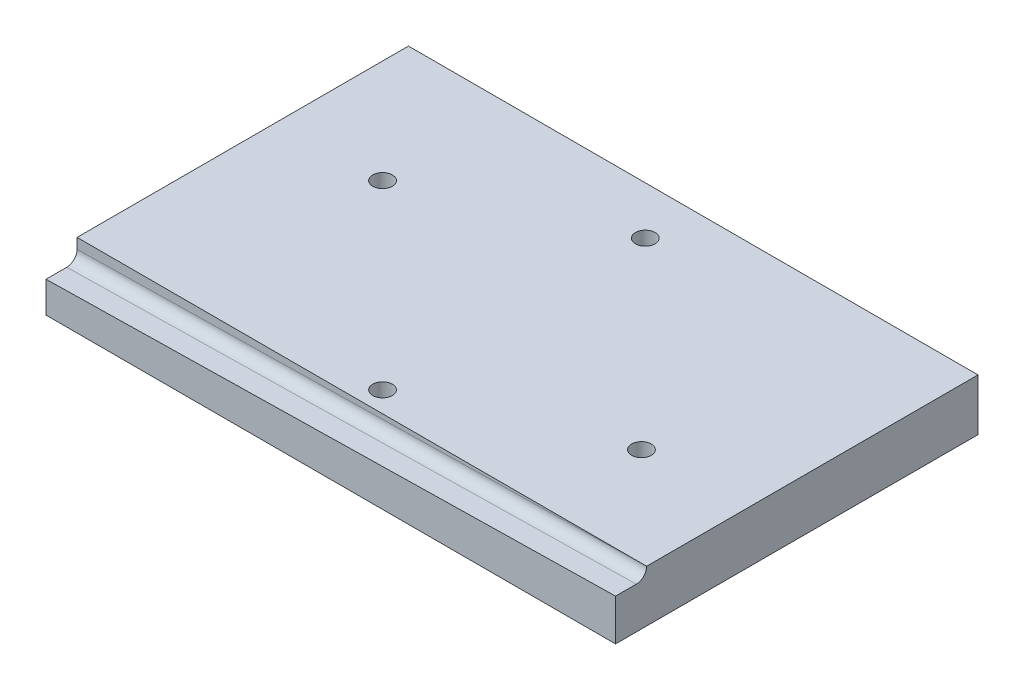
ISO-10303-21;
HEADER;
FILE_DESCRIPTION(('STEP AP214'),'2;1');
FILE_NAME('part.step','',(''),(''),'','','');
FILE_SCHEMA(('AUTOMOTIVE_DESIGN { 1 0 10303 214 1 1 1 1 }'));
ENDSEC;
DATA;
#1=APPLICATION_CONTEXT('core data for automotive mechanical design processes');
#2=APPLICATION_PROTOCOL_DEFINITION('international standard','automotive_design',2000,#1);
#3=PRODUCT_CONTEXT('',#1,'mechanical');
#4=PRODUCT('Part','Part','',(#3));
#5=PRODUCT_RELATED_PRODUCT_CATEGORY('part','',(#4));
#6=PRODUCT_DEFINITION_FORMATION('','',#4);
#7=PRODUCT_DEFINITION_CONTEXT('part definition',#1,'design');
#8=PRODUCT_DEFINITION('design','',#6,#7);
#9=PRODUCT_DEFINITION_SHAPE('','',#8);
#10=(LENGTH_UNIT() NAMED_UNIT(*) SI_UNIT(.MILLI.,.METRE.));
#11=(NAMED_UNIT(*) PLANE_ANGLE_UNIT() SI_UNIT($,.RADIAN.));
#12=(NAMED_UNIT(*) SI_UNIT($,.STERADIAN.) SOLID_ANGLE_UNIT());
#13=UNCERTAINTY_MEASURE_WITH_UNIT(LENGTH_MEASURE(1.E-05),#10,'distance_accuracy_value','');
#14=(GEOMETRIC_REPRESENTATION_CONTEXT(3) GLOBAL_UNCERTAINTY_ASSIGNED_CONTEXT((#13)) GLOBAL_UNIT_ASSIGNED_CONTEXT((#10,
#11,#12)) REPRESENTATION_CONTEXT('',''));
#15=CARTESIAN_POINT('',(0.,0.,0.));
#16=DIRECTION('',(0.,0.,1.));
#17=DIRECTION('',(1.,0.,0.));
#18=AXIS2_PLACEMENT_3D('',#15,#16,#17);
#19=CARTESIAN_POINT('',(-45.1305913271504,-20.,-39.3903610709062));
#20=DIRECTION('',(0.,0.,-1.));
#21=DIRECTION('',(-1.,0.,0.));
#22=AXIS2_PLACEMENT_3D('',#19,#20,#21);
#23=PLANE('',#22);
#24=DIRECTION('',(1.,0.,0.));
#25=VECTOR('',#24,1.);
#26=CARTESIAN_POINT('',(-45.1305913271504,-10.,-39.3903610709062));
#27=LINE('',#26,#25);
#28=CARTESIAN_POINT('',(-45.1305913271504,-10.,-39.3903610709062));
#29=VERTEX_POINT('',#28);
#30=CARTESIAN_POINT('',(64.8694086728496,-10.,-39.3903610709062));
#31=VERTEX_POINT('',#30);
#32=EDGE_CURVE('E136',#29,#31,#27,.T.);
#33=ORIENTED_EDGE('',*,*,#32,.T.);
#34=DIRECTION('',(0.,1.,0.));
#35=VECTOR('',#34,1.);
#36=CARTESIAN_POINT('',(64.8694086728496,-20.,-39.3903610709062));
#37=LINE('',#36,#35);
#38=CARTESIAN_POINT('',(64.8694086728496,-20.,-39.3903610709062));
#39=VERTEX_POINT('',#38);
#40=EDGE_CURVE('E115',#39,#31,#37,.T.);
#41=ORIENTED_EDGE('',*,*,#40,.F.);
#42=DIRECTION('',(1.,0.,0.));
#43=VECTOR('',#42,1.);
#44=CARTESIAN_POINT('',(-45.1305913271504,-20.,-39.3903610709062));
#45=LINE('',#44,#43);
#46=CARTESIAN_POINT('',(-45.1305913271504,-20.,-39.3903610709062));
#47=VERTEX_POINT('',#46);
#48=EDGE_CURVE('E138',#47,#39,#45,.T.);
#49=ORIENTED_EDGE('',*,*,#48,.F.);
#50=DIRECTION('',(0.,1.,0.));
#51=VECTOR('',#50,1.);
#52=CARTESIAN_POINT('',(-45.1305913271504,-20.,-39.3903610709062));
#53=LINE('',#52,#51);
#54=EDGE_CURVE('E117',#47,#29,#53,.T.);
#55=ORIENTED_EDGE('',*,*,#54,.T.);
#56=EDGE_LOOP('',(#33,#41,#49,#55));
#57=FACE_BOUND('',#56,.T.);
#58=ADVANCED_FACE('F36',(#57),#23,.T.);
#59=CARTESIAN_POINT('',(-45.1305913271504,-20.,30.6096389290938));
#60=DIRECTION('',(-1.,0.,0.));
#61=DIRECTION('',(0.,0.,1.));
#62=AXIS2_PLACEMENT_3D('',#59,#60,#61);
#63=PLANE('',#62);
#64=DIRECTION('',(0.,1.,0.));
#65=VECTOR('',#64,1.);
#66=CARTESIAN_POINT('',(-45.1305913271504,-10.,24.6096389290938));
#67=LINE('',#66,#65);
#68=CARTESIAN_POINT('',(-45.1305913271504,-11.9996694488036,24.6096389290938));
#69=VERTEX_POINT('',#68);
#70=CARTESIAN_POINT('',(-45.1305913271504,-10.,24.6096389290938));
#71=VERTEX_POINT('',#70);
#72=EDGE_CURVE('E100',#69,#71,#67,.T.);
#73=ORIENTED_EDGE('',*,*,#72,.T.);
#74=DIRECTION('',(0.,0.,-1.));
#75=VECTOR('',#74,1.);
#76=CARTESIAN_POINT('',(-45.1305913271504,-10.,30.6096389290938));
#77=LINE('',#76,#75);
#78=EDGE_CURVE('E135',#71,#29,#77,.T.);
#79=ORIENTED_EDGE('',*,*,#78,.T.);
#80=ORIENTED_EDGE('',*,*,#54,.F.);
#81=DIRECTION('',(0.,0.,-1.));
#82=VECTOR('',#81,1.);
#83=CARTESIAN_POINT('',(-45.1305913271504,-20.,30.6096389290938));
#84=LINE('',#83,#82);
#85=CARTESIAN_POINT('',(-45.1305913271504,-20.,30.6096389290938));
#86=VERTEX_POINT('',#85);
#87=EDGE_CURVE('E120',#86,#47,#84,.T.);
#88=ORIENTED_EDGE('',*,*,#87,.F.);
#89=DIRECTION('',(0.,1.,0.));
#90=VECTOR('',#89,1.);
#91=CARTESIAN_POINT('',(-45.1305913271504,-20.,30.6096389290938));
#92=LINE('',#91,#90);
#93=CARTESIAN_POINT('',(-45.1305913271504,-14.,30.6096389290938));
#94=VERTEX_POINT('',#93);
#95=EDGE_CURVE('E114',#86,#94,#92,.T.);
#96=ORIENTED_EDGE('',*,*,#95,.T.);
#97=DIRECTION('',(0.,0.,1.));
#98=VECTOR('',#97,1.);
#99=CARTESIAN_POINT('',(-45.1305913271504,-14.,24.6096389290938));
#100=LINE('',#99,#98);
#101=CARTESIAN_POINT('',(-45.1305913271504,-14.,26.6096389290938));
#102=VERTEX_POINT('',#101);
#103=EDGE_CURVE('E99',#102,#94,#100,.T.);
#104=ORIENTED_EDGE('',*,*,#103,.F.);
#105=CARTESIAN_POINT('',(-45.1305913271504,-11.9996694488036,26.6096389290938));
#106=DIRECTION('',(1.,0.,0.));
#107=DIRECTION('',(0.,1.,0.));
#108=AXIS2_PLACEMENT_3D('',#105,#106,#107);
#109=ELLIPSE('',#108,2.00033055119637,2.);
#110=EDGE_CURVE('E127',#69,#102,#109,.F.);
#111=ORIENTED_EDGE('',*,*,#110,.F.);
#112=EDGE_LOOP('',(#73,#79,#80,#88,#96,#104,#111));
#113=FACE_BOUND('',#112,.T.);
#114=ADVANCED_FACE('F155',(#113),#63,.T.);
#115=CARTESIAN_POINT('',(-45.1305913271504,-20.,30.6096389290938));
#116=DIRECTION('',(0.,0.,-1.));
#117=DIRECTION('',(-1.,0.,0.));
#118=AXIS2_PLACEMENT_3D('',#115,#116,#117);
#119=PLANE('',#118);
#120=ORIENTED_EDGE('',*,*,#95,.F.);
#121=DIRECTION('',(1.,0.,0.));
#122=VECTOR('',#121,1.);
#123=CARTESIAN_POINT('',(-45.1305913271504,-20.,30.6096389290938));
#124=LINE('',#123,#122);
#125=CARTESIAN_POINT('',(64.8694086728496,-20.,30.6096389290938));
#126=VERTEX_POINT('',#125);
#127=EDGE_CURVE('E113',#86,#126,#124,.T.);
#128=ORIENTED_EDGE('',*,*,#127,.T.);
#129=DIRECTION('',(0.,1.,0.));
#130=VECTOR('',#129,1.);
#131=CARTESIAN_POINT('',(64.8694086728496,-20.,30.6096389290938));
#132=LINE('',#131,#130);
#133=CARTESIAN_POINT('',(64.8694086728496,-12.,30.6096389290938));
#134=VERTEX_POINT('',#133);
#135=EDGE_CURVE('E95',#126,#134,#132,.T.);
#136=ORIENTED_EDGE('',*,*,#135,.T.);
#137=DIRECTION('',(-0.999834751713323,-0.018178813667515,0.));
#138=VECTOR('',#137,1.);
#139=CARTESIAN_POINT('',(-45.1305913271504,-14.,30.6096389290938));
#140=LINE('',#139,#138);
#141=EDGE_CURVE('E103',#134,#94,#140,.T.);
#142=ORIENTED_EDGE('',*,*,#141,.T.);
#143=EDGE_LOOP('',(#120,#128,#136,#142));
#144=FACE_BOUND('',#143,.T.);
#145=ADVANCED_FACE('F112',(#144),#119,.F.);
#146=CARTESIAN_POINT('',(64.8694086728496,-20.,30.6096389290938));
#147=DIRECTION('',(-1.,0.,0.));
#148=DIRECTION('',(0.,0.,1.));
#149=AXIS2_PLACEMENT_3D('',#146,#147,#148);
#150=PLANE('',#149);
#151=ORIENTED_EDGE('',*,*,#135,.F.);
#152=DIRECTION('',(0.,0.,-1.));
#153=VECTOR('',#152,1.);
#154=CARTESIAN_POINT('',(64.8694086728496,-20.,30.6096389290938));
#155=LINE('',#154,#153);
#156=EDGE_CURVE('E168',#126,#39,#155,.T.);
#157=ORIENTED_EDGE('',*,*,#156,.T.);
#158=ORIENTED_EDGE('',*,*,#40,.T.);
#159=DIRECTION('',(0.,0.,-1.));
#160=VECTOR('',#159,1.);
#161=CARTESIAN_POINT('',(64.8694086728496,-10.,30.6096389290938));
#162=LINE('',#161,#160);
#163=CARTESIAN_POINT('',(64.8694086728496,-10.,24.6096389564008));
#164=VERTEX_POINT('',#163);
#165=EDGE_CURVE('E130',#164,#31,#162,.T.);
#166=ORIENTED_EDGE('',*,*,#165,.F.);
#167=CARTESIAN_POINT('',(64.8694086728496,-9.99966944880363,26.6096389290938));
#168=DIRECTION('',(1.,0.,0.));
#169=DIRECTION('',(0.,1.,0.));
#170=AXIS2_PLACEMENT_3D('',#167,#168,#169);
#171=ELLIPSE('',#170,2.00033055119637,2.);
#172=CARTESIAN_POINT('',(64.8694086728496,-12.,26.6096389290938));
#173=VERTEX_POINT('',#172);
#174=EDGE_CURVE('E45',#173,#164,#171,.T.);
#175=ORIENTED_EDGE('',*,*,#174,.F.);
#176=DIRECTION('',(0.,0.,1.));
#177=VECTOR('',#176,1.);
#178=CARTESIAN_POINT('',(64.8694086728496,-12.,24.6096389290938));
#179=LINE('',#178,#177);
#180=EDGE_CURVE('E91',#173,#134,#179,.T.);
#181=ORIENTED_EDGE('',*,*,#180,.T.);
#182=EDGE_LOOP('',(#151,#157,#158,#166,#175,#181));
#183=FACE_BOUND('',#182,.T.);
#184=ADVANCED_FACE('F93',(#183),#150,.F.);
#185=CARTESIAN_POINT('',(0.,-20.,0.));
#186=DIRECTION('',(0.,-1.,0.));
#187=DIRECTION('',(0.,0.,1.));
#188=AXIS2_PLACEMENT_3D('',#185,#186,#187);
#189=PLANE('',#188);
#190=CARTESIAN_POINT('',(-25.1305913271504,-20.,-14.3903610709062));
#191=DIRECTION('',(0.,-1.,0.));
#192=DIRECTION('',(0.,0.,-1.));
#193=AXIS2_PLACEMENT_3D('',#190,#191,#192);
#194=CIRCLE('',#193,1.9);
#195=CARTESIAN_POINT('',(-25.1305913271504,-20.,-16.2903610709062));
#196=VERTEX_POINT('',#195);
#197=EDGE_CURVE('E280',#196,#196,#194,.T.);
#198=ORIENTED_EDGE('',*,*,#197,.F.);
#199=EDGE_LOOP('',(#198));
#200=FACE_BOUND('',#199,.T.);
#201=CARTESIAN_POINT('',(44.8694086728496,-20.,5.60963892909377));
#202=DIRECTION('',(0.,-1.,0.));
#203=DIRECTION('',(0.,0.,-1.));
#204=AXIS2_PLACEMENT_3D('',#201,#202,#203);
#205=CIRCLE('',#204,1.9);
#206=CARTESIAN_POINT('',(44.8694086728496,-20.,3.70963892909377));
#207=VERTEX_POINT('',#206);
#208=EDGE_CURVE('E288',#207,#207,#205,.T.);
#209=ORIENTED_EDGE('',*,*,#208,.F.);
#210=EDGE_LOOP('',(#209));
#211=FACE_BOUND('',#210,.T.);
#212=CARTESIAN_POINT('',(9.86940867284957,-20.,-30.128732457806));
#213=DIRECTION('',(0.,-1.,0.));
#214=DIRECTION('',(0.,0.,-1.));
#215=AXIS2_PLACEMENT_3D('',#212,#213,#214);
#216=CIRCLE('',#215,1.9);
#217=CARTESIAN_POINT('',(9.86940867284957,-20.,-32.028732457806));
#218=VERTEX_POINT('',#217);
#219=EDGE_CURVE('E110',#218,#218,#216,.T.);
#220=ORIENTED_EDGE('',*,*,#219,.F.);
#221=EDGE_LOOP('',(#220));
#222=FACE_BOUND('',#221,.T.);
#223=CARTESIAN_POINT('',(9.86940867284957,-20.,20.6096389290938));
#224=DIRECTION('',(0.,1.,0.));
#225=DIRECTION('',(0.,0.,1.));
#226=AXIS2_PLACEMENT_3D('',#223,#224,#225);
#227=CIRCLE('',#226,1.9);
#228=CARTESIAN_POINT('',(9.86940867284957,-20.,22.5096389290938));
#229=VERTEX_POINT('',#228);
#230=EDGE_CURVE('E161',#229,#229,#227,.T.);
#231=ORIENTED_EDGE('',*,*,#230,.T.);
#232=EDGE_LOOP('',(#231));
#233=FACE_BOUND('',#232,.T.);
#234=ORIENTED_EDGE('',*,*,#48,.T.);
#235=ORIENTED_EDGE('',*,*,#156,.F.);
#236=ORIENTED_EDGE('',*,*,#127,.F.);
#237=ORIENTED_EDGE('',*,*,#87,.T.);
#238=EDGE_LOOP('',(#234,#235,#236,#237));
#239=FACE_BOUND('',#238,.T.);
#240=ADVANCED_FACE('F171',(#200,#211,#222,#233,#239),#189,.T.);
#241=CARTESIAN_POINT('',(0.,-10.,0.));
#242=DIRECTION('',(0.,-1.,0.));
#243=DIRECTION('',(0.,0.,1.));
#244=AXIS2_PLACEMENT_3D('',#241,#242,#243);
#245=PLANE('',#244);
#246=CARTESIAN_POINT('',(-25.1305913271504,-10.,-14.3903610709062));
#247=DIRECTION('',(0.,-1.,0.));
#248=DIRECTION('',(0.,0.,-1.));
#249=AXIS2_PLACEMENT_3D('',#246,#247,#248);
#250=CIRCLE('',#249,1.9);
#251=CARTESIAN_POINT('',(-25.1305913271504,-10.,-16.2903610709062));
#252=VERTEX_POINT('',#251);
#253=EDGE_CURVE('E283',#252,#252,#250,.T.);
#254=ORIENTED_EDGE('',*,*,#253,.T.);
#255=EDGE_LOOP('',(#254));
#256=FACE_BOUND('',#255,.T.);
#257=CARTESIAN_POINT('',(44.8694086728496,-10.,5.60963892909377));
#258=DIRECTION('',(0.,-1.,0.));
#259=DIRECTION('',(0.,0.,-1.));
#260=AXIS2_PLACEMENT_3D('',#257,#258,#259);
#261=CIRCLE('',#260,1.9);
#262=CARTESIAN_POINT('',(44.8694086728496,-10.,3.70963892909377));
#263=VERTEX_POINT('',#262);
#264=EDGE_CURVE('E285',#263,#263,#261,.T.);
#265=ORIENTED_EDGE('',*,*,#264,.T.);
#266=EDGE_LOOP('',(#265));
#267=FACE_BOUND('',#266,.T.);
#268=CARTESIAN_POINT('',(9.86940867284957,-10.,-30.128732457806));
#269=DIRECTION('',(0.,-1.,0.));
#270=DIRECTION('',(0.,0.,-1.));
#271=AXIS2_PLACEMENT_3D('',#268,#269,#270);
#272=CIRCLE('',#271,1.9);
#273=CARTESIAN_POINT('',(9.86940867284957,-10.,-32.028732457806));
#274=VERTEX_POINT('',#273);
#275=EDGE_CURVE('E291',#274,#274,#272,.T.);
#276=ORIENTED_EDGE('',*,*,#275,.T.);
#277=EDGE_LOOP('',(#276));
#278=FACE_BOUND('',#277,.T.);
#279=CARTESIAN_POINT('',(9.86940867284957,-10.,20.6096389290938));
#280=DIRECTION('',(0.,1.,0.));
#281=DIRECTION('',(0.,0.,1.));
#282=AXIS2_PLACEMENT_3D('',#279,#280,#281);
#283=CIRCLE('',#282,1.9);
#284=CARTESIAN_POINT('',(9.86940867284957,-10.,22.5096389290938));
#285=VERTEX_POINT('',#284);
#286=EDGE_CURVE('E140',#285,#285,#283,.T.);
#287=ORIENTED_EDGE('',*,*,#286,.F.);
#288=EDGE_LOOP('',(#287));
#289=FACE_BOUND('',#288,.T.);
#290=ORIENTED_EDGE('',*,*,#165,.T.);
#291=ORIENTED_EDGE('',*,*,#32,.F.);
#292=ORIENTED_EDGE('',*,*,#78,.F.);
#293=DIRECTION('',(1.,0.,0.));
#294=VECTOR('',#293,1.);
#295=CARTESIAN_POINT('',(64.8694086728496,-10.,24.6096389290938));
#296=LINE('',#295,#294);
#297=CARTESIAN_POINT('',(64.8512283570491,-10.,24.6096389290938));
#298=VERTEX_POINT('',#297);
#299=EDGE_CURVE('E109',#71,#298,#296,.T.);
#300=ORIENTED_EDGE('',*,*,#299,.T.);
#301=CARTESIAN_POINT('',(64.851228357049,-10.,26.6096389290938));
#302=DIRECTION('',(0.,1.,0.));
#303=DIRECTION('',(1.,0.,0.));
#304=AXIS2_PLACEMENT_3D('',#301,#302,#303);
#305=ELLIPSE('',#304,110.018180315801,2.);
#306=EDGE_CURVE('E11',#164,#298,#305,.T.);
#307=ORIENTED_EDGE('',*,*,#306,.F.);
#308=EDGE_LOOP('',(#290,#291,#292,#300,#307));
#309=FACE_BOUND('',#308,.T.);
#310=ADVANCED_FACE('F151',(#256,#267,#278,#289,#309),#245,.F.);
#311=CARTESIAN_POINT('',(9.86940867284957,-10.,20.6096389290938));
#312=DIRECTION('',(0.,-1.,0.));
#313=DIRECTION('',(0.,0.,1.));
#314=AXIS2_PLACEMENT_3D('',#311,#312,#313);
#315=CYLINDRICAL_SURFACE('',#314,1.9);
#316=ORIENTED_EDGE('',*,*,#286,.T.);
#317=EDGE_LOOP('',(#316));
#318=FACE_BOUND('',#317,.T.);
#319=ORIENTED_EDGE('',*,*,#230,.F.);
#320=EDGE_LOOP('',(#319));
#321=FACE_BOUND('',#320,.T.);
#322=ADVANCED_FACE('F179',(#318,#321),#315,.F.);
#323=CARTESIAN_POINT('',(-45.1305913271504,-14.,24.6096389290938));
#324=DIRECTION('',(0.018178813667515,-0.999834751713323,0.));
#325=DIRECTION('',(-0.999834751713323,-0.018178813667515,0.));
#326=AXIS2_PLACEMENT_3D('',#323,#324,#325);
#327=PLANE('',#326);
#328=ORIENTED_EDGE('',*,*,#103,.T.);
#329=ORIENTED_EDGE('',*,*,#141,.F.);
#330=ORIENTED_EDGE('',*,*,#180,.F.);
#331=DIRECTION('',(-0.999834751713323,-0.018178813667515,0.));
#332=VECTOR('',#331,1.);
#333=CARTESIAN_POINT('',(64.8694086728496,-12.,26.6096389290938));
#334=LINE('',#333,#332);
#335=EDGE_CURVE('E52',#102,#173,#334,.F.);
#336=ORIENTED_EDGE('',*,*,#335,.F.);
#337=EDGE_LOOP('',(#328,#329,#330,#336));
#338=FACE_BOUND('',#337,.T.);
#339=ADVANCED_FACE('F104',(#338),#327,.F.);
#340=CARTESIAN_POINT('',(0.,-10.,24.6096389290938));
#341=DIRECTION('',(0.,0.,-1.));
#342=DIRECTION('',(-1.,0.,0.));
#343=AXIS2_PLACEMENT_3D('',#340,#341,#342);
#344=PLANE('',#343);
#345=ORIENTED_EDGE('',*,*,#299,.F.);
#346=ORIENTED_EDGE('',*,*,#72,.F.);
#347=DIRECTION('',(-0.999834751713323,-0.018178813667515,0.));
#348=VECTOR('',#347,1.);
#349=CARTESIAN_POINT('',(-45.1669489544855,-12.0003304965734,24.6096389290938));
#350=LINE('',#349,#348);
#351=EDGE_CURVE('E124',#298,#69,#350,.T.);
#352=ORIENTED_EDGE('',*,*,#351,.F.);
#353=EDGE_LOOP('',(#345,#346,#352));
#354=FACE_BOUND('',#353,.T.);
#355=ADVANCED_FACE('F230',(#354),#344,.F.);
#356=CARTESIAN_POINT('',(9.86940867284957,-20.,-30.128732457806));
#357=DIRECTION('',(0.,1.,0.));
#358=DIRECTION('',(0.,0.,-1.));
#359=AXIS2_PLACEMENT_3D('',#356,#357,#358);
#360=CYLINDRICAL_SURFACE('',#359,1.9);
#361=ORIENTED_EDGE('',*,*,#219,.T.);
#362=EDGE_LOOP('',(#361));
#363=FACE_BOUND('',#362,.T.);
#364=ORIENTED_EDGE('',*,*,#275,.F.);
#365=EDGE_LOOP('',(#364));
#366=FACE_BOUND('',#365,.T.);
#367=ADVANCED_FACE('F240',(#363,#366),#360,.F.);
#368=CARTESIAN_POINT('',(0.021431337857584,-11.1787235821671,26.6096389290938));
#369=DIRECTION('',(0.999834751713323,0.018178813667515,0.));
#370=DIRECTION('',(0.018178813667515,-0.999834751713323,0.));
#371=AXIS2_PLACEMENT_3D('',#368,#369,#370);
#372=CYLINDRICAL_SURFACE('',#371,2.);
#373=ORIENTED_EDGE('',*,*,#174,.T.);
#374=ORIENTED_EDGE('',*,*,#306,.T.);
#375=ORIENTED_EDGE('',*,*,#351,.T.);
#376=ORIENTED_EDGE('',*,*,#110,.T.);
#377=ORIENTED_EDGE('',*,*,#335,.T.);
#378=EDGE_LOOP('',(#373,#374,#375,#376,#377));
#379=FACE_BOUND('',#378,.T.);
#380=ADVANCED_FACE('F38',(#379),#372,.F.);
#381=CARTESIAN_POINT('',(44.8694086728496,-20.,5.60963892909377));
#382=DIRECTION('',(0.,1.,0.));
#383=DIRECTION('',(0.,0.,-1.));
#384=AXIS2_PLACEMENT_3D('',#381,#382,#383);
#385=CYLINDRICAL_SURFACE('',#384,1.9);
#386=ORIENTED_EDGE('',*,*,#208,.T.);
#387=EDGE_LOOP('',(#386));
#388=FACE_BOUND('',#387,.T.);
#389=ORIENTED_EDGE('',*,*,#264,.F.);
#390=EDGE_LOOP('',(#389));
#391=FACE_BOUND('',#390,.T.);
#392=ADVANCED_FACE('F257',(#388,#391),#385,.F.);
#393=CARTESIAN_POINT('',(-25.1305913271504,-20.,-14.3903610709062));
#394=DIRECTION('',(0.,1.,0.));
#395=DIRECTION('',(0.,0.,-1.));
#396=AXIS2_PLACEMENT_3D('',#393,#394,#395);
#397=CYLINDRICAL_SURFACE('',#396,1.9);
#398=ORIENTED_EDGE('',*,*,#197,.T.);
#399=EDGE_LOOP('',(#398));
#400=FACE_BOUND('',#399,.T.);
#401=ORIENTED_EDGE('',*,*,#253,.F.);
#402=EDGE_LOOP('',(#401));
#403=FACE_BOUND('',#402,.T.);
#404=ADVANCED_FACE('F265',(#400,#403),#397,.F.);
#405=CLOSED_SHELL('',(#58,#114,#145,#184,#240,#310,#322,#339,#355,#367,#380,#392,#404));
#406=MANIFOLD_SOLID_BREP('B2',#405);
#407=ADVANCED_BREP_SHAPE_REPRESENTATION('',(#18,#406),#14);
#408=SHAPE_DEFINITION_REPRESENTATION(#9,#407);
ENDSEC;
END-ISO-10303-21;
